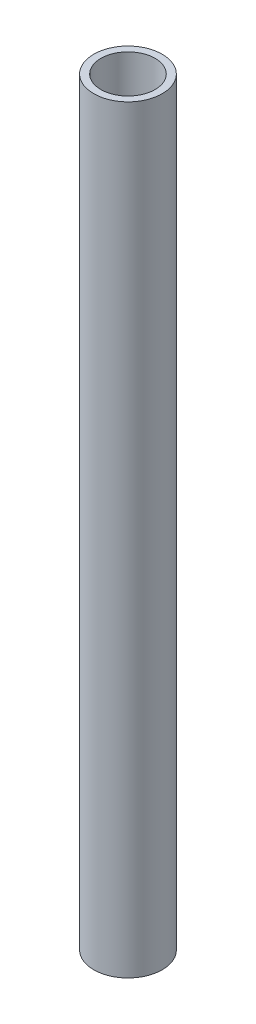
ISO-10303-21;
HEADER;
FILE_DESCRIPTION(('STEP AP214'),'2;1');
FILE_NAME('part.step','',(''),(''),'','','');
FILE_SCHEMA(('AUTOMOTIVE_DESIGN { 1 0 10303 214 1 1 1 1 }'));
ENDSEC;
DATA;
#1=APPLICATION_CONTEXT('core data for automotive mechanical design processes');
#2=APPLICATION_PROTOCOL_DEFINITION('international standard','automotive_design',2000,#1);
#3=PRODUCT_CONTEXT('',#1,'mechanical');
#4=PRODUCT('Part','Part','',(#3));
#5=PRODUCT_RELATED_PRODUCT_CATEGORY('part','',(#4));
#6=PRODUCT_DEFINITION_FORMATION('','',#4);
#7=PRODUCT_DEFINITION_CONTEXT('part definition',#1,'design');
#8=PRODUCT_DEFINITION('design','',#6,#7);
#9=PRODUCT_DEFINITION_SHAPE('','',#8);
#10=(LENGTH_UNIT() NAMED_UNIT(*) SI_UNIT(.MILLI.,.METRE.));
#11=(NAMED_UNIT(*) PLANE_ANGLE_UNIT() SI_UNIT($,.RADIAN.));
#12=(NAMED_UNIT(*) SI_UNIT($,.STERADIAN.) SOLID_ANGLE_UNIT());
#13=UNCERTAINTY_MEASURE_WITH_UNIT(LENGTH_MEASURE(1.E-05),#10,'distance_accuracy_value','');
#14=(GEOMETRIC_REPRESENTATION_CONTEXT(3) GLOBAL_UNCERTAINTY_ASSIGNED_CONTEXT((#13)) GLOBAL_UNIT_ASSIGNED_CONTEXT((#10,
#11,#12)) REPRESENTATION_CONTEXT('',''));
#15=CARTESIAN_POINT('',(0.,0.,0.));
#16=DIRECTION('',(0.,0.,1.));
#17=DIRECTION('',(1.,0.,0.));
#18=AXIS2_PLACEMENT_3D('',#15,#16,#17);
#19=CARTESIAN_POINT('',(0.,266.,0.));
#20=DIRECTION('',(0.,1.,0.));
#21=DIRECTION('',(0.,0.,1.));
#22=AXIS2_PLACEMENT_3D('',#19,#20,#21);
#23=PLANE('',#22);
#24=CARTESIAN_POINT('',(0.,266.,0.));
#25=DIRECTION('',(0.,1.,0.));
#26=DIRECTION('',(0.,0.,1.));
#27=AXIS2_PLACEMENT_3D('',#24,#25,#26);
#28=CIRCLE('',#27,12.);
#29=CARTESIAN_POINT('',(0.,266.,12.));
#30=VERTEX_POINT('',#29);
#31=EDGE_CURVE('E10',#30,#30,#28,.T.);
#32=ORIENTED_EDGE('',*,*,#31,.T.);
#33=EDGE_LOOP('',(#32));
#34=FACE_BOUND('',#33,.T.);
#35=CARTESIAN_POINT('',(0.,266.,0.));
#36=DIRECTION('',(0.,1.,0.));
#37=DIRECTION('',(0.,0.,1.));
#38=AXIS2_PLACEMENT_3D('',#35,#36,#37);
#39=CIRCLE('',#38,9.5);
#40=CARTESIAN_POINT('',(0.,266.,9.5));
#41=VERTEX_POINT('',#40);
#42=EDGE_CURVE('E46',#41,#41,#39,.T.);
#43=ORIENTED_EDGE('',*,*,#42,.F.);
#44=EDGE_LOOP('',(#43));
#45=FACE_BOUND('',#44,.T.);
#46=ADVANCED_FACE('F35',(#34,#45),#23,.T.);
#47=CARTESIAN_POINT('',(0.,0.,0.));
#48=DIRECTION('',(0.,1.,0.));
#49=DIRECTION('',(0.,0.,1.));
#50=AXIS2_PLACEMENT_3D('',#47,#48,#49);
#51=PLANE('',#50);
#52=CARTESIAN_POINT('',(0.,0.,0.));
#53=DIRECTION('',(0.,1.,0.));
#54=DIRECTION('',(0.,0.,1.));
#55=AXIS2_PLACEMENT_3D('',#52,#53,#54);
#56=CIRCLE('',#55,12.);
#57=CARTESIAN_POINT('',(0.,0.,12.));
#58=VERTEX_POINT('',#57);
#59=EDGE_CURVE('E39',#58,#58,#56,.T.);
#60=ORIENTED_EDGE('',*,*,#59,.F.);
#61=EDGE_LOOP('',(#60));
#62=FACE_BOUND('',#61,.T.);
#63=CARTESIAN_POINT('',(0.,0.,0.));
#64=DIRECTION('',(0.,1.,0.));
#65=DIRECTION('',(0.,0.,1.));
#66=AXIS2_PLACEMENT_3D('',#63,#64,#65);
#67=CIRCLE('',#66,9.5);
#68=CARTESIAN_POINT('',(0.,0.,9.5));
#69=VERTEX_POINT('',#68);
#70=EDGE_CURVE('E48',#69,#69,#67,.T.);
#71=ORIENTED_EDGE('',*,*,#70,.T.);
#72=EDGE_LOOP('',(#71));
#73=FACE_BOUND('',#72,.T.);
#74=ADVANCED_FACE('F58',(#62,#73),#51,.F.);
#75=CARTESIAN_POINT('',(0.,266.,0.));
#76=DIRECTION('',(0.,-1.,0.));
#77=DIRECTION('',(0.,0.,-1.));
#78=AXIS2_PLACEMENT_3D('',#75,#76,#77);
#79=CYLINDRICAL_SURFACE('',#78,12.);
#80=ORIENTED_EDGE('',*,*,#31,.F.);
#81=EDGE_LOOP('',(#80));
#82=FACE_BOUND('',#81,.T.);
#83=ORIENTED_EDGE('',*,*,#59,.T.);
#84=EDGE_LOOP('',(#83));
#85=FACE_BOUND('',#84,.T.);
#86=ADVANCED_FACE('F37',(#82,#85),#79,.T.);
#87=CARTESIAN_POINT('',(0.,266.,0.));
#88=DIRECTION('',(0.,-1.,0.));
#89=DIRECTION('',(0.,0.,-1.));
#90=AXIS2_PLACEMENT_3D('',#87,#88,#89);
#91=CYLINDRICAL_SURFACE('',#90,9.5);
#92=ORIENTED_EDGE('',*,*,#42,.T.);
#93=EDGE_LOOP('',(#92));
#94=FACE_BOUND('',#93,.T.);
#95=ORIENTED_EDGE('',*,*,#70,.F.);
#96=EDGE_LOOP('',(#95));
#97=FACE_BOUND('',#96,.T.);
#98=ADVANCED_FACE('F54',(#94,#97),#91,.F.);
#99=CLOSED_SHELL('',(#46,#74,#86,#98));
#100=MANIFOLD_SOLID_BREP('B2',#99);
#101=ADVANCED_BREP_SHAPE_REPRESENTATION('',(#18,#100),#14);
#102=SHAPE_DEFINITION_REPRESENTATION(#9,#101);
ENDSEC;
END-ISO-10303-21;
